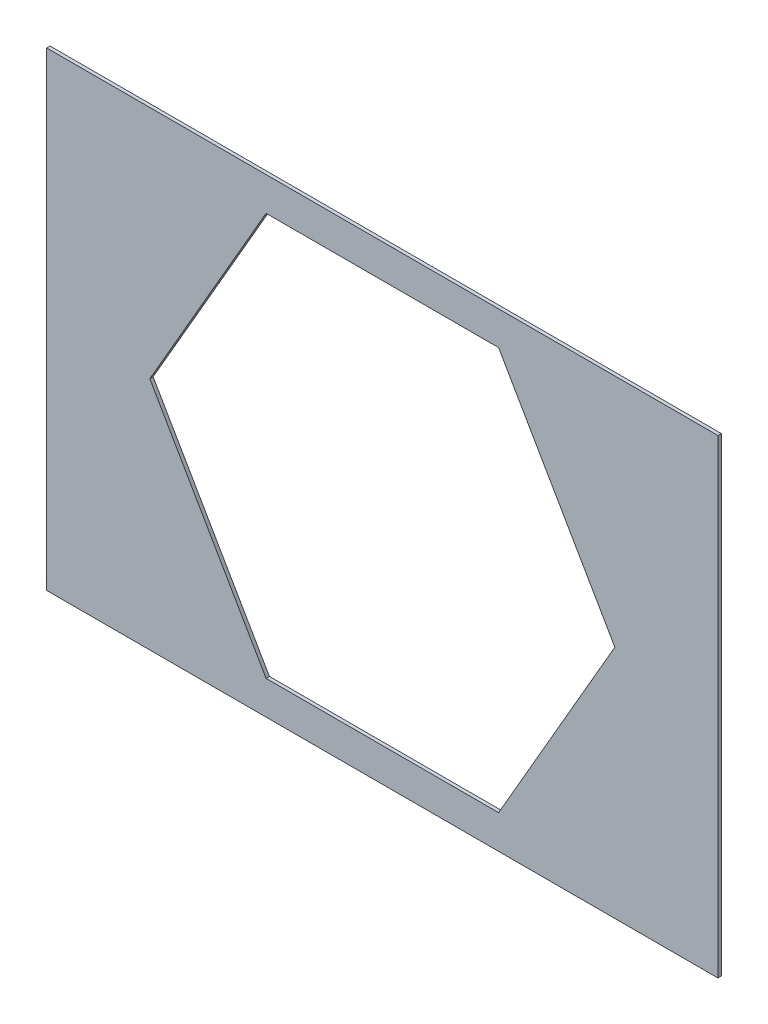
ISO-10303-21;
HEADER;
FILE_DESCRIPTION(('STEP AP214'),'2;1');
FILE_NAME('part.step','',(''),(''),'','','');
FILE_SCHEMA(('AUTOMOTIVE_DESIGN { 1 0 10303 214 1 1 1 1 }'));
ENDSEC;
DATA;
#1=APPLICATION_CONTEXT('core data for automotive mechanical design processes');
#2=APPLICATION_PROTOCOL_DEFINITION('international standard','automotive_design',2000,#1);
#3=PRODUCT_CONTEXT('',#1,'mechanical');
#4=PRODUCT('Part','Part','',(#3));
#5=PRODUCT_RELATED_PRODUCT_CATEGORY('part','',(#4));
#6=PRODUCT_DEFINITION_FORMATION('','',#4);
#7=PRODUCT_DEFINITION_CONTEXT('part definition',#1,'design');
#8=PRODUCT_DEFINITION('design','',#6,#7);
#9=PRODUCT_DEFINITION_SHAPE('','',#8);
#10=(LENGTH_UNIT() NAMED_UNIT(*) SI_UNIT(.MILLI.,.METRE.));
#11=(NAMED_UNIT(*) PLANE_ANGLE_UNIT() SI_UNIT($,.RADIAN.));
#12=(NAMED_UNIT(*) SI_UNIT($,.STERADIAN.) SOLID_ANGLE_UNIT());
#13=UNCERTAINTY_MEASURE_WITH_UNIT(LENGTH_MEASURE(1.E-05),#10,'distance_accuracy_value','');
#14=(GEOMETRIC_REPRESENTATION_CONTEXT(3) GLOBAL_UNCERTAINTY_ASSIGNED_CONTEXT((#13)) GLOBAL_UNIT_ASSIGNED_CONTEXT((#10,
#11,#12)) REPRESENTATION_CONTEXT('',''));
#15=CARTESIAN_POINT('',(0.,0.,0.));
#16=DIRECTION('',(0.,0.,1.));
#17=DIRECTION('',(1.,0.,0.));
#18=AXIS2_PLACEMENT_3D('',#15,#16,#17);
#19=CARTESIAN_POINT('',(0.,0.,6.35));
#20=DIRECTION('',(0.,0.,1.));
#21=DIRECTION('',(1.,0.,0.));
#22=AXIS2_PLACEMENT_3D('',#19,#20,#21);
#23=PLANE('',#22);
#24=DIRECTION('',(0.,-1.,0.));
#25=VECTOR('',#24,1.);
#26=CARTESIAN_POINT('',(-635.,-444.5,6.35));
#27=LINE('',#26,#25);
#28=CARTESIAN_POINT('',(-635.,444.5,6.35));
#29=VERTEX_POINT('',#28);
#30=CARTESIAN_POINT('',(-635.,-444.5,6.35));
#31=VERTEX_POINT('',#30);
#32=EDGE_CURVE('E186',#29,#31,#27,.T.);
#33=ORIENTED_EDGE('',*,*,#32,.T.);
#34=DIRECTION('',(1.,0.,0.));
#35=VECTOR('',#34,1.);
#36=CARTESIAN_POINT('',(635.,-444.5,6.35));
#37=LINE('',#36,#35);
#38=CARTESIAN_POINT('',(635.,-444.5,6.35));
#39=VERTEX_POINT('',#38);
#40=EDGE_CURVE('E190',#31,#39,#37,.T.);
#41=ORIENTED_EDGE('',*,*,#40,.T.);
#42=DIRECTION('',(0.,1.,0.));
#43=VECTOR('',#42,1.);
#44=CARTESIAN_POINT('',(635.,-444.5,6.35));
#45=LINE('',#44,#43);
#46=CARTESIAN_POINT('',(635.,444.5,6.35));
#47=VERTEX_POINT('',#46);
#48=EDGE_CURVE('E194',#39,#47,#45,.T.);
#49=ORIENTED_EDGE('',*,*,#48,.T.);
#50=DIRECTION('',(-1.,0.,0.));
#51=VECTOR('',#50,1.);
#52=CARTESIAN_POINT('',(635.,444.5,6.35));
#53=LINE('',#52,#51);
#54=EDGE_CURVE('E197',#47,#29,#53,.T.);
#55=ORIENTED_EDGE('',*,*,#54,.T.);
#56=EDGE_LOOP('',(#33,#41,#49,#55));
#57=FACE_BOUND('',#56,.T.);
#58=DIRECTION('',(0.500000000000001,-0.866025403784438,0.));
#59=VECTOR('',#58,1.);
#60=CARTESIAN_POINT('',(-439.940905122495,0.,6.35));
#61=LINE('',#60,#59);
#62=CARTESIAN_POINT('',(-439.940905122495,0.,6.35));
#63=VERTEX_POINT('',#62);
#64=CARTESIAN_POINT('',(-219.970452561247,-381.,6.35));
#65=VERTEX_POINT('',#64);
#66=EDGE_CURVE('E126',#63,#65,#61,.T.);
#67=ORIENTED_EDGE('',*,*,#66,.F.);
#68=DIRECTION('',(-0.499999999999995,-0.866025403784442,0.));
#69=VECTOR('',#68,1.);
#70=CARTESIAN_POINT('',(-219.970452561252,380.999999999997,6.35));
#71=LINE('',#70,#69);
#72=CARTESIAN_POINT('',(-219.970452561252,380.999999999997,6.35));
#73=VERTEX_POINT('',#72);
#74=EDGE_CURVE('E117',#73,#63,#71,.T.);
#75=ORIENTED_EDGE('',*,*,#74,.F.);
#76=DIRECTION('',(-1.,0.,0.));
#77=VECTOR('',#76,1.);
#78=CARTESIAN_POINT('',(219.970452561244,381.000000000002,6.35));
#79=LINE('',#78,#77);
#80=CARTESIAN_POINT('',(219.970452561244,381.000000000002,6.35));
#81=VERTEX_POINT('',#80);
#82=EDGE_CURVE('E152',#81,#73,#79,.T.);
#83=ORIENTED_EDGE('',*,*,#82,.F.);
#84=DIRECTION('',(-0.500000000000007,0.866025403784435,0.));
#85=VECTOR('',#84,1.);
#86=CARTESIAN_POINT('',(439.940905122495,3.0720909208579E-12,6.35));
#87=LINE('',#86,#85);
#88=CARTESIAN_POINT('',(439.940905122495,3.0720909208579E-12,6.35));
#89=VERTEX_POINT('',#88);
#90=EDGE_CURVE('E149',#89,#81,#87,.T.);
#91=ORIENTED_EDGE('',*,*,#90,.F.);
#92=DIRECTION('',(0.499999999999995,0.866025403784442,0.));
#93=VECTOR('',#92,1.);
#94=CARTESIAN_POINT('',(219.970452561249,-380.999999999999,6.35));
#95=LINE('',#94,#93);
#96=CARTESIAN_POINT('',(219.970452561249,-380.999999999999,6.35));
#97=VERTEX_POINT('',#96);
#98=EDGE_CURVE('E144',#97,#89,#95,.T.);
#99=ORIENTED_EDGE('',*,*,#98,.F.);
#100=DIRECTION('',(1.,0.,0.));
#101=VECTOR('',#100,1.);
#102=CARTESIAN_POINT('',(-219.970452561247,-381.,6.35));
#103=LINE('',#102,#101);
#104=EDGE_CURVE('E140',#65,#97,#103,.T.);
#105=ORIENTED_EDGE('',*,*,#104,.F.);
#106=EDGE_LOOP('',(#67,#75,#83,#91,#99,#105));
#107=FACE_BOUND('',#106,.T.);
#108=ADVANCED_FACE('F39',(#57,#107),#23,.T.);
#109=CARTESIAN_POINT('',(0.,0.,0.));
#110=DIRECTION('',(0.,0.,1.));
#111=DIRECTION('',(1.,0.,0.));
#112=AXIS2_PLACEMENT_3D('',#109,#110,#111);
#113=PLANE('',#112);
#114=DIRECTION('',(0.,-1.,0.));
#115=VECTOR('',#114,1.);
#116=CARTESIAN_POINT('',(-635.,-444.5,0.));
#117=LINE('',#116,#115);
#118=CARTESIAN_POINT('',(-635.,444.5,0.));
#119=VERTEX_POINT('',#118);
#120=CARTESIAN_POINT('',(-635.,-444.5,0.));
#121=VERTEX_POINT('',#120);
#122=EDGE_CURVE('E135',#119,#121,#117,.T.);
#123=ORIENTED_EDGE('',*,*,#122,.F.);
#124=DIRECTION('',(-1.,0.,0.));
#125=VECTOR('',#124,1.);
#126=CARTESIAN_POINT('',(635.,444.5,0.));
#127=LINE('',#126,#125);
#128=CARTESIAN_POINT('',(635.,444.5,0.));
#129=VERTEX_POINT('',#128);
#130=EDGE_CURVE('E191',#129,#119,#127,.T.);
#131=ORIENTED_EDGE('',*,*,#130,.F.);
#132=DIRECTION('',(0.,1.,0.));
#133=VECTOR('',#132,1.);
#134=CARTESIAN_POINT('',(635.,-444.5,0.));
#135=LINE('',#134,#133);
#136=CARTESIAN_POINT('',(635.,-444.5,0.));
#137=VERTEX_POINT('',#136);
#138=EDGE_CURVE('E207',#137,#129,#135,.T.);
#139=ORIENTED_EDGE('',*,*,#138,.F.);
#140=DIRECTION('',(1.,0.,0.));
#141=VECTOR('',#140,1.);
#142=CARTESIAN_POINT('',(635.,-444.5,0.));
#143=LINE('',#142,#141);
#144=EDGE_CURVE('E204',#121,#137,#143,.T.);
#145=ORIENTED_EDGE('',*,*,#144,.F.);
#146=EDGE_LOOP('',(#123,#131,#139,#145));
#147=FACE_BOUND('',#146,.T.);
#148=DIRECTION('',(-0.499999999999995,-0.866025403784442,0.));
#149=VECTOR('',#148,1.);
#150=CARTESIAN_POINT('',(-219.970452561252,380.999999999997,0.));
#151=LINE('',#150,#149);
#152=CARTESIAN_POINT('',(-219.970452561252,380.999999999997,0.));
#153=VERTEX_POINT('',#152);
#154=CARTESIAN_POINT('',(-439.940905122495,0.,0.));
#155=VERTEX_POINT('',#154);
#156=EDGE_CURVE('E63',#153,#155,#151,.T.);
#157=ORIENTED_EDGE('',*,*,#156,.T.);
#158=DIRECTION('',(0.500000000000001,-0.866025403784438,0.));
#159=VECTOR('',#158,1.);
#160=CARTESIAN_POINT('',(-439.940905122495,0.,0.));
#161=LINE('',#160,#159);
#162=CARTESIAN_POINT('',(-219.970452561247,-381.,0.));
#163=VERTEX_POINT('',#162);
#164=EDGE_CURVE('E133',#155,#163,#161,.T.);
#165=ORIENTED_EDGE('',*,*,#164,.T.);
#166=DIRECTION('',(1.,0.,0.));
#167=VECTOR('',#166,1.);
#168=CARTESIAN_POINT('',(-219.970452561247,-381.,0.));
#169=LINE('',#168,#167);
#170=CARTESIAN_POINT('',(219.970452561249,-380.999999999999,0.));
#171=VERTEX_POINT('',#170);
#172=EDGE_CURVE('E159',#163,#171,#169,.T.);
#173=ORIENTED_EDGE('',*,*,#172,.T.);
#174=DIRECTION('',(0.499999999999995,0.866025403784442,0.));
#175=VECTOR('',#174,1.);
#176=CARTESIAN_POINT('',(219.970452561249,-380.999999999999,0.));
#177=LINE('',#176,#175);
#178=CARTESIAN_POINT('',(439.940905122495,3.0720909208579E-12,0.));
#179=VERTEX_POINT('',#178);
#180=EDGE_CURVE('E163',#171,#179,#177,.T.);
#181=ORIENTED_EDGE('',*,*,#180,.T.);
#182=DIRECTION('',(-0.500000000000007,0.866025403784435,0.));
#183=VECTOR('',#182,1.);
#184=CARTESIAN_POINT('',(439.940905122495,3.0720909208579E-12,0.));
#185=LINE('',#184,#183);
#186=CARTESIAN_POINT('',(219.970452561244,381.000000000002,0.));
#187=VERTEX_POINT('',#186);
#188=EDGE_CURVE('E167',#179,#187,#185,.T.);
#189=ORIENTED_EDGE('',*,*,#188,.T.);
#190=DIRECTION('',(-1.,0.,0.));
#191=VECTOR('',#190,1.);
#192=CARTESIAN_POINT('',(219.970452561244,381.000000000002,0.));
#193=LINE('',#192,#191);
#194=EDGE_CURVE('E127',#187,#153,#193,.T.);
#195=ORIENTED_EDGE('',*,*,#194,.T.);
#196=EDGE_LOOP('',(#157,#165,#173,#181,#189,#195));
#197=FACE_BOUND('',#196,.T.);
#198=ADVANCED_FACE('F230',(#147,#197),#113,.F.);
#199=CARTESIAN_POINT('',(-635.,-444.5,6.35));
#200=DIRECTION('',(1.,0.,0.));
#201=DIRECTION('',(0.,0.,-1.));
#202=AXIS2_PLACEMENT_3D('',#199,#200,#201);
#203=PLANE('',#202);
#204=ORIENTED_EDGE('',*,*,#122,.T.);
#205=DIRECTION('',(0.,0.,-1.));
#206=VECTOR('',#205,1.);
#207=CARTESIAN_POINT('',(-635.,-444.5,6.35));
#208=LINE('',#207,#206);
#209=EDGE_CURVE('E11',#31,#121,#208,.T.);
#210=ORIENTED_EDGE('',*,*,#209,.F.);
#211=ORIENTED_EDGE('',*,*,#32,.F.);
#212=DIRECTION('',(0.,0.,-1.));
#213=VECTOR('',#212,1.);
#214=CARTESIAN_POINT('',(-635.,444.5,6.35));
#215=LINE('',#214,#213);
#216=EDGE_CURVE('E200',#29,#119,#215,.T.);
#217=ORIENTED_EDGE('',*,*,#216,.T.);
#218=EDGE_LOOP('',(#204,#210,#211,#217));
#219=FACE_BOUND('',#218,.T.);
#220=ADVANCED_FACE('F41',(#219),#203,.F.);
#221=CARTESIAN_POINT('',(635.,-444.5,6.35));
#222=DIRECTION('',(0.,1.,0.));
#223=DIRECTION('',(-1.,0.,0.));
#224=AXIS2_PLACEMENT_3D('',#221,#222,#223);
#225=PLANE('',#224);
#226=ORIENTED_EDGE('',*,*,#144,.T.);
#227=DIRECTION('',(0.,0.,-1.));
#228=VECTOR('',#227,1.);
#229=CARTESIAN_POINT('',(635.,-444.5,6.35));
#230=LINE('',#229,#228);
#231=EDGE_CURVE('E48',#39,#137,#230,.T.);
#232=ORIENTED_EDGE('',*,*,#231,.F.);
#233=ORIENTED_EDGE('',*,*,#40,.F.);
#234=ORIENTED_EDGE('',*,*,#209,.T.);
#235=EDGE_LOOP('',(#226,#232,#233,#234));
#236=FACE_BOUND('',#235,.T.);
#237=ADVANCED_FACE('F240',(#236),#225,.F.);
#238=CARTESIAN_POINT('',(635.,-444.5,6.35));
#239=DIRECTION('',(-1.,0.,0.));
#240=DIRECTION('',(0.,0.,1.));
#241=AXIS2_PLACEMENT_3D('',#238,#239,#240);
#242=PLANE('',#241);
#243=ORIENTED_EDGE('',*,*,#138,.T.);
#244=DIRECTION('',(0.,0.,-1.));
#245=VECTOR('',#244,1.);
#246=CARTESIAN_POINT('',(635.,444.5,6.35));
#247=LINE('',#246,#245);
#248=EDGE_CURVE('E215',#47,#129,#247,.T.);
#249=ORIENTED_EDGE('',*,*,#248,.F.);
#250=ORIENTED_EDGE('',*,*,#48,.F.);
#251=ORIENTED_EDGE('',*,*,#231,.T.);
#252=EDGE_LOOP('',(#243,#249,#250,#251));
#253=FACE_BOUND('',#252,.T.);
#254=ADVANCED_FACE('F224',(#253),#242,.F.);
#255=CARTESIAN_POINT('',(635.,444.5,6.35));
#256=DIRECTION('',(0.,-1.,0.));
#257=DIRECTION('',(1.,0.,0.));
#258=AXIS2_PLACEMENT_3D('',#255,#256,#257);
#259=PLANE('',#258);
#260=ORIENTED_EDGE('',*,*,#130,.T.);
#261=ORIENTED_EDGE('',*,*,#216,.F.);
#262=ORIENTED_EDGE('',*,*,#54,.F.);
#263=ORIENTED_EDGE('',*,*,#248,.T.);
#264=EDGE_LOOP('',(#260,#261,#262,#263));
#265=FACE_BOUND('',#264,.T.);
#266=ADVANCED_FACE('F234',(#265),#259,.F.);
#267=CARTESIAN_POINT('',(-219.970452561252,380.999999999997,6.35));
#268=DIRECTION('',(0.866025403784442,-0.499999999999995,0.));
#269=DIRECTION('',(0.499999999999995,0.866025403784442,0.));
#270=AXIS2_PLACEMENT_3D('',#267,#268,#269);
#271=PLANE('',#270);
#272=ORIENTED_EDGE('',*,*,#156,.F.);
#273=DIRECTION('',(0.,0.,-1.));
#274=VECTOR('',#273,1.);
#275=CARTESIAN_POINT('',(-219.970452561252,380.999999999997,6.35));
#276=LINE('',#275,#274);
#277=EDGE_CURVE('E121',#73,#153,#276,.T.);
#278=ORIENTED_EDGE('',*,*,#277,.F.);
#279=ORIENTED_EDGE('',*,*,#74,.T.);
#280=DIRECTION('',(0.,0.,-1.));
#281=VECTOR('',#280,1.);
#282=CARTESIAN_POINT('',(-439.940905122495,0.,6.35));
#283=LINE('',#282,#281);
#284=EDGE_CURVE('E120',#63,#155,#283,.T.);
#285=ORIENTED_EDGE('',*,*,#284,.T.);
#286=EDGE_LOOP('',(#272,#278,#279,#285));
#287=FACE_BOUND('',#286,.T.);
#288=ADVANCED_FACE('F119',(#287),#271,.T.);
#289=CARTESIAN_POINT('',(-439.940905122495,0.,6.35));
#290=DIRECTION('',(0.866025403784438,0.500000000000001,0.));
#291=DIRECTION('',(-0.500000000000001,0.866025403784438,0.));
#292=AXIS2_PLACEMENT_3D('',#289,#290,#291);
#293=PLANE('',#292);
#294=ORIENTED_EDGE('',*,*,#164,.F.);
#295=ORIENTED_EDGE('',*,*,#284,.F.);
#296=ORIENTED_EDGE('',*,*,#66,.T.);
#297=DIRECTION('',(0.,0.,-1.));
#298=VECTOR('',#297,1.);
#299=CARTESIAN_POINT('',(-219.970452561247,-381.,6.35));
#300=LINE('',#299,#298);
#301=EDGE_CURVE('E136',#65,#163,#300,.T.);
#302=ORIENTED_EDGE('',*,*,#301,.T.);
#303=EDGE_LOOP('',(#294,#295,#296,#302));
#304=FACE_BOUND('',#303,.T.);
#305=ADVANCED_FACE('F130',(#304),#293,.T.);
#306=CARTESIAN_POINT('',(-219.970452561247,-381.,6.35));
#307=DIRECTION('',(0.,1.,0.));
#308=DIRECTION('',(-1.,0.,0.));
#309=AXIS2_PLACEMENT_3D('',#306,#307,#308);
#310=PLANE('',#309);
#311=ORIENTED_EDGE('',*,*,#172,.F.);
#312=ORIENTED_EDGE('',*,*,#301,.F.);
#313=ORIENTED_EDGE('',*,*,#104,.T.);
#314=DIRECTION('',(0.,0.,-1.));
#315=VECTOR('',#314,1.);
#316=CARTESIAN_POINT('',(219.970452561249,-380.999999999999,6.35));
#317=LINE('',#316,#315);
#318=EDGE_CURVE('E181',#97,#171,#317,.T.);
#319=ORIENTED_EDGE('',*,*,#318,.T.);
#320=EDGE_LOOP('',(#311,#312,#313,#319));
#321=FACE_BOUND('',#320,.T.);
#322=ADVANCED_FACE('F263',(#321),#310,.T.);
#323=CARTESIAN_POINT('',(219.970452561249,-380.999999999999,6.35));
#324=DIRECTION('',(-0.866025403784441,0.499999999999995,0.));
#325=DIRECTION('',(-0.499999999999995,-0.866025403784442,0.));
#326=AXIS2_PLACEMENT_3D('',#323,#324,#325);
#327=PLANE('',#326);
#328=ORIENTED_EDGE('',*,*,#180,.F.);
#329=ORIENTED_EDGE('',*,*,#318,.F.);
#330=ORIENTED_EDGE('',*,*,#98,.T.);
#331=DIRECTION('',(0.,0.,-1.));
#332=VECTOR('',#331,1.);
#333=CARTESIAN_POINT('',(439.940905122495,3.0720909208579E-12,6.35));
#334=LINE('',#333,#332);
#335=EDGE_CURVE('E178',#89,#179,#334,.T.);
#336=ORIENTED_EDGE('',*,*,#335,.T.);
#337=EDGE_LOOP('',(#328,#329,#330,#336));
#338=FACE_BOUND('',#337,.T.);
#339=ADVANCED_FACE('F267',(#338),#327,.T.);
#340=CARTESIAN_POINT('',(439.940905122495,3.0720909208579E-12,6.35));
#341=DIRECTION('',(-0.866025403784435,-0.500000000000007,0.));
#342=DIRECTION('',(0.500000000000007,-0.866025403784435,0.));
#343=AXIS2_PLACEMENT_3D('',#340,#341,#342);
#344=PLANE('',#343);
#345=ORIENTED_EDGE('',*,*,#188,.F.);
#346=ORIENTED_EDGE('',*,*,#335,.F.);
#347=ORIENTED_EDGE('',*,*,#90,.T.);
#348=DIRECTION('',(0.,0.,-1.));
#349=VECTOR('',#348,1.);
#350=CARTESIAN_POINT('',(219.970452561244,381.000000000002,6.35));
#351=LINE('',#350,#349);
#352=EDGE_CURVE('E55',#81,#187,#351,.T.);
#353=ORIENTED_EDGE('',*,*,#352,.T.);
#354=EDGE_LOOP('',(#345,#346,#347,#353));
#355=FACE_BOUND('',#354,.T.);
#356=ADVANCED_FACE('F273',(#355),#344,.T.);
#357=CARTESIAN_POINT('',(219.970452561244,381.000000000002,6.35));
#358=DIRECTION('',(0.,-1.,0.));
#359=DIRECTION('',(1.,0.,0.));
#360=AXIS2_PLACEMENT_3D('',#357,#358,#359);
#361=PLANE('',#360);
#362=ORIENTED_EDGE('',*,*,#194,.F.);
#363=ORIENTED_EDGE('',*,*,#352,.F.);
#364=ORIENTED_EDGE('',*,*,#82,.T.);
#365=ORIENTED_EDGE('',*,*,#277,.T.);
#366=EDGE_LOOP('',(#362,#363,#364,#365));
#367=FACE_BOUND('',#366,.T.);
#368=ADVANCED_FACE('F277',(#367),#361,.T.);
#369=CLOSED_SHELL('',(#108,#198,#220,#237,#254,#266,#288,#305,#322,#339,#356,#368));
#370=MANIFOLD_SOLID_BREP('B2',#369);
#371=ADVANCED_BREP_SHAPE_REPRESENTATION('',(#18,#370),#14);
#372=SHAPE_DEFINITION_REPRESENTATION(#9,#371);
ENDSEC;
END-ISO-10303-21;
